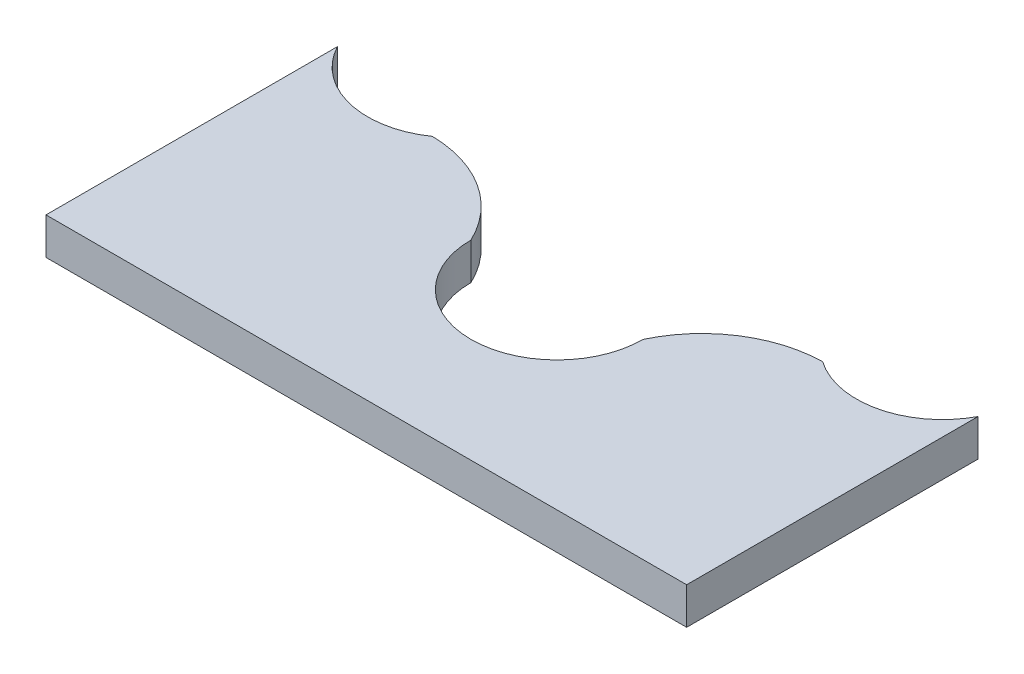
ISO-10303-21;
HEADER;
FILE_DESCRIPTION(('STEP AP214'),'2;1');
FILE_NAME('part.step','',(''),(''),'','','');
FILE_SCHEMA(('AUTOMOTIVE_DESIGN { 1 0 10303 214 1 1 1 1 }'));
ENDSEC;
DATA;
#1=APPLICATION_CONTEXT('core data for automotive mechanical design processes');
#2=APPLICATION_PROTOCOL_DEFINITION('international standard','automotive_design',2000,#1);
#3=PRODUCT_CONTEXT('',#1,'mechanical');
#4=PRODUCT('Part','Part','',(#3));
#5=PRODUCT_RELATED_PRODUCT_CATEGORY('part','',(#4));
#6=PRODUCT_DEFINITION_FORMATION('','',#4);
#7=PRODUCT_DEFINITION_CONTEXT('part definition',#1,'design');
#8=PRODUCT_DEFINITION('design','',#6,#7);
#9=PRODUCT_DEFINITION_SHAPE('','',#8);
#10=(LENGTH_UNIT() NAMED_UNIT(*) SI_UNIT(.MILLI.,.METRE.));
#11=(NAMED_UNIT(*) PLANE_ANGLE_UNIT() SI_UNIT($,.RADIAN.));
#12=(NAMED_UNIT(*) SI_UNIT($,.STERADIAN.) SOLID_ANGLE_UNIT());
#13=UNCERTAINTY_MEASURE_WITH_UNIT(LENGTH_MEASURE(1.E-05),#10,'distance_accuracy_value','');
#14=(GEOMETRIC_REPRESENTATION_CONTEXT(3) GLOBAL_UNCERTAINTY_ASSIGNED_CONTEXT((#13)) GLOBAL_UNIT_ASSIGNED_CONTEXT((#10,
#11,#12)) REPRESENTATION_CONTEXT('',''));
#15=CARTESIAN_POINT('',(0.,0.,0.));
#16=DIRECTION('',(0.,0.,1.));
#17=DIRECTION('',(1.,0.,0.));
#18=AXIS2_PLACEMENT_3D('',#15,#16,#17);
#19=CARTESIAN_POINT('',(16.0451571243017,3.,4.26440295899608));
#20=DIRECTION('',(0.,-1.,0.));
#21=DIRECTION('',(0.,0.,-1.));
#22=AXIS2_PLACEMENT_3D('',#19,#20,#21);
#23=CYLINDRICAL_SURFACE('',#22,10.);
#24=CARTESIAN_POINT('',(16.0451571243017,0.,4.26440295899608));
#25=DIRECTION('',(0.,1.,0.));
#26=DIRECTION('',(0.,0.,1.));
#27=AXIS2_PLACEMENT_3D('',#24,#25,#26);
#28=CIRCLE('',#27,10.);
#29=CARTESIAN_POINT('',(15.8700792263388,0.,-5.73406431002295));
#30=VERTEX_POINT('',#29);
#31=CARTESIAN_POINT('',(7.,0.,0.));
#32=VERTEX_POINT('',#31);
#33=EDGE_CURVE('E135',#30,#32,#28,.T.);
#34=ORIENTED_EDGE('',*,*,#33,.T.);
#35=DIRECTION('',(0.,-1.,0.));
#36=VECTOR('',#35,1.);
#37=CARTESIAN_POINT('',(7.,3.,0.));
#38=LINE('',#37,#36);
#39=CARTESIAN_POINT('',(7.,3.,0.));
#40=VERTEX_POINT('',#39);
#41=EDGE_CURVE('E11',#40,#32,#38,.T.);
#42=ORIENTED_EDGE('',*,*,#41,.F.);
#43=CARTESIAN_POINT('',(16.0451571243017,3.,4.26440295899608));
#44=DIRECTION('',(0.,1.,0.));
#45=DIRECTION('',(0.,0.,1.));
#46=AXIS2_PLACEMENT_3D('',#43,#44,#45);
#47=CIRCLE('',#46,10.);
#48=CARTESIAN_POINT('',(15.8700792263388,3.,-5.73406431002295));
#49=VERTEX_POINT('',#48);
#50=EDGE_CURVE('E149',#49,#40,#47,.T.);
#51=ORIENTED_EDGE('',*,*,#50,.F.);
#52=DIRECTION('',(0.,-1.,0.));
#53=VECTOR('',#52,1.);
#54=CARTESIAN_POINT('',(15.8700792263388,3.,-5.73406431002295));
#55=LINE('',#54,#53);
#56=EDGE_CURVE('E131',#49,#30,#55,.T.);
#57=ORIENTED_EDGE('',*,*,#56,.T.);
#58=EDGE_LOOP('',(#34,#42,#51,#57));
#59=FACE_BOUND('',#58,.T.);
#60=ADVANCED_FACE('F39',(#59),#23,.T.);
#61=CARTESIAN_POINT('',(0.,3.,0.));
#62=DIRECTION('',(0.,-1.,0.));
#63=DIRECTION('',(0.,0.,-1.));
#64=AXIS2_PLACEMENT_3D('',#61,#62,#63);
#65=CYLINDRICAL_SURFACE('',#64,7.);
#66=CARTESIAN_POINT('',(0.,0.,0.));
#67=DIRECTION('',(0.,-1.,0.));
#68=DIRECTION('',(0.,0.,-1.));
#69=AXIS2_PLACEMENT_3D('',#66,#67,#68);
#70=CIRCLE('',#69,7.);
#71=CARTESIAN_POINT('',(-7.,0.,0.));
#72=VERTEX_POINT('',#71);
#73=EDGE_CURVE('E138',#32,#72,#70,.T.);
#74=ORIENTED_EDGE('',*,*,#73,.T.);
#75=DIRECTION('',(0.,-1.,0.));
#76=VECTOR('',#75,1.);
#77=CARTESIAN_POINT('',(-7.,3.,0.));
#78=LINE('',#77,#76);
#79=CARTESIAN_POINT('',(-7.,3.,0.));
#80=VERTEX_POINT('',#79);
#81=EDGE_CURVE('E47',#80,#72,#78,.T.);
#82=ORIENTED_EDGE('',*,*,#81,.F.);
#83=CARTESIAN_POINT('',(0.,3.,0.));
#84=DIRECTION('',(0.,-1.,0.));
#85=DIRECTION('',(0.,0.,-1.));
#86=AXIS2_PLACEMENT_3D('',#83,#84,#85);
#87=CIRCLE('',#86,7.);
#88=EDGE_CURVE('E98',#40,#80,#87,.T.);
#89=ORIENTED_EDGE('',*,*,#88,.F.);
#90=ORIENTED_EDGE('',*,*,#41,.T.);
#91=EDGE_LOOP('',(#74,#82,#89,#90));
#92=FACE_BOUND('',#91,.T.);
#93=ADVANCED_FACE('F184',(#92),#65,.F.);
#94=CARTESIAN_POINT('',(-16.0451571243017,3.,4.26440295899608));
#95=DIRECTION('',(0.,-1.,0.));
#96=DIRECTION('',(0.,0.,-1.));
#97=AXIS2_PLACEMENT_3D('',#94,#95,#96);
#98=CYLINDRICAL_SURFACE('',#97,9.99999999999999);
#99=CARTESIAN_POINT('',(-16.0451571243017,0.,4.26440295899608));
#100=DIRECTION('',(0.,1.,0.));
#101=DIRECTION('',(0.,0.,1.));
#102=AXIS2_PLACEMENT_3D('',#99,#100,#101);
#103=CIRCLE('',#102,9.99999999999999);
#104=CARTESIAN_POINT('',(-15.8700792263388,0.,-5.73406431002294));
#105=VERTEX_POINT('',#104);
#106=EDGE_CURVE('E140',#72,#105,#103,.T.);
#107=ORIENTED_EDGE('',*,*,#106,.T.);
#108=DIRECTION('',(0.,-1.,0.));
#109=VECTOR('',#108,1.);
#110=CARTESIAN_POINT('',(-15.8700792263388,3.,-5.73406431002294));
#111=LINE('',#110,#109);
#112=CARTESIAN_POINT('',(-15.8700792263388,3.,-5.73406431002294));
#113=VERTEX_POINT('',#112);
#114=EDGE_CURVE('E156',#113,#105,#111,.T.);
#115=ORIENTED_EDGE('',*,*,#114,.F.);
#116=CARTESIAN_POINT('',(-16.0451571243017,3.,4.26440295899608));
#117=DIRECTION('',(0.,1.,0.));
#118=DIRECTION('',(0.,0.,1.));
#119=AXIS2_PLACEMENT_3D('',#116,#117,#118);
#120=CIRCLE('',#119,9.99999999999999);
#121=EDGE_CURVE('E164',#80,#113,#120,.T.);
#122=ORIENTED_EDGE('',*,*,#121,.F.);
#123=ORIENTED_EDGE('',*,*,#81,.T.);
#124=EDGE_LOOP('',(#107,#115,#122,#123));
#125=FACE_BOUND('',#124,.T.);
#126=ADVANCED_FACE('F162',(#125),#98,.T.);
#127=CARTESIAN_POINT('',(-19.8752830168529,3.,-11.4749999999999));
#128=DIRECTION('',(0.,-1.,0.));
#129=DIRECTION('',(0.,0.,-1.));
#130=AXIS2_PLACEMENT_3D('',#127,#128,#129);
#131=CYLINDRICAL_SURFACE('',#130,7.);
#132=CARTESIAN_POINT('',(-19.8752830168529,0.,-11.4749999999999));
#133=DIRECTION('',(0.,-1.,0.));
#134=DIRECTION('',(0.,0.,-1.));
#135=AXIS2_PLACEMENT_3D('',#132,#133,#134);
#136=CIRCLE('',#135,7.);
#137=CARTESIAN_POINT('',(-26.0555691185354,0.,-8.18804644064587));
#138=VERTEX_POINT('',#137);
#139=EDGE_CURVE('E142',#105,#138,#136,.T.);
#140=ORIENTED_EDGE('',*,*,#139,.T.);
#141=DIRECTION('',(0.,-1.,0.));
#142=VECTOR('',#141,1.);
#143=CARTESIAN_POINT('',(-26.0555691185354,3.,-8.18804644064587));
#144=LINE('',#143,#142);
#145=CARTESIAN_POINT('',(-26.0555691185354,3.,-8.18804644064587));
#146=VERTEX_POINT('',#145);
#147=EDGE_CURVE('E153',#146,#138,#144,.T.);
#148=ORIENTED_EDGE('',*,*,#147,.F.);
#149=CARTESIAN_POINT('',(-19.8752830168529,3.,-11.4749999999999));
#150=DIRECTION('',(0.,-1.,0.));
#151=DIRECTION('',(0.,0.,-1.));
#152=AXIS2_PLACEMENT_3D('',#149,#150,#151);
#153=CIRCLE('',#152,7.);
#154=EDGE_CURVE('E176',#113,#146,#153,.T.);
#155=ORIENTED_EDGE('',*,*,#154,.F.);
#156=ORIENTED_EDGE('',*,*,#114,.T.);
#157=EDGE_LOOP('',(#140,#148,#155,#156));
#158=FACE_BOUND('',#157,.T.);
#159=ADVANCED_FACE('F172',(#158),#131,.F.);
#160=CARTESIAN_POINT('',(-26.0555691185354,3.,15.5111622184162));
#161=DIRECTION('',(1.,0.,0.));
#162=DIRECTION('',(0.,0.,-1.));
#163=AXIS2_PLACEMENT_3D('',#160,#161,#162);
#164=PLANE('',#163);
#165=DIRECTION('',(0.,0.,1.));
#166=VECTOR('',#165,1.);
#167=CARTESIAN_POINT('',(-26.0555691185354,0.,15.5111622184162));
#168=LINE('',#167,#166);
#169=CARTESIAN_POINT('',(-26.0555691185354,0.,15.5111622184162));
#170=VERTEX_POINT('',#169);
#171=EDGE_CURVE('E144',#138,#170,#168,.T.);
#172=ORIENTED_EDGE('',*,*,#171,.T.);
#173=DIRECTION('',(0.,-1.,0.));
#174=VECTOR('',#173,1.);
#175=CARTESIAN_POINT('',(-26.0555691185354,3.,15.5111622184162));
#176=LINE('',#175,#174);
#177=CARTESIAN_POINT('',(-26.0555691185354,3.,15.5111622184162));
#178=VERTEX_POINT('',#177);
#179=EDGE_CURVE('E126',#178,#170,#176,.T.);
#180=ORIENTED_EDGE('',*,*,#179,.F.);
#181=DIRECTION('',(0.,0.,1.));
#182=VECTOR('',#181,1.);
#183=CARTESIAN_POINT('',(-26.0555691185354,3.,15.5111622184162));
#184=LINE('',#183,#182);
#185=EDGE_CURVE('E117',#146,#178,#184,.T.);
#186=ORIENTED_EDGE('',*,*,#185,.F.);
#187=ORIENTED_EDGE('',*,*,#147,.T.);
#188=EDGE_LOOP('',(#172,#180,#186,#187));
#189=FACE_BOUND('',#188,.T.);
#190=ADVANCED_FACE('F175',(#189),#164,.F.);
#191=CARTESIAN_POINT('',(26.0555691185354,3.,15.5111622184162));
#192=DIRECTION('',(0.,0.,-1.));
#193=DIRECTION('',(-1.,0.,0.));
#194=AXIS2_PLACEMENT_3D('',#191,#192,#193);
#195=PLANE('',#194);
#196=DIRECTION('',(1.,0.,0.));
#197=VECTOR('',#196,1.);
#198=CARTESIAN_POINT('',(26.0555691185354,0.,15.5111622184162));
#199=LINE('',#198,#197);
#200=CARTESIAN_POINT('',(26.0555691185354,0.,15.5111622184162));
#201=VERTEX_POINT('',#200);
#202=EDGE_CURVE('E125',#170,#201,#199,.T.);
#203=ORIENTED_EDGE('',*,*,#202,.T.);
#204=DIRECTION('',(0.,-1.,0.));
#205=VECTOR('',#204,1.);
#206=CARTESIAN_POINT('',(26.0555691185354,3.,15.5111622184162));
#207=LINE('',#206,#205);
#208=CARTESIAN_POINT('',(26.0555691185354,3.,15.5111622184162));
#209=VERTEX_POINT('',#208);
#210=EDGE_CURVE('E122',#209,#201,#207,.T.);
#211=ORIENTED_EDGE('',*,*,#210,.F.);
#212=DIRECTION('',(1.,0.,0.));
#213=VECTOR('',#212,1.);
#214=CARTESIAN_POINT('',(26.0555691185354,3.,15.5111622184162));
#215=LINE('',#214,#213);
#216=EDGE_CURVE('E111',#178,#209,#215,.T.);
#217=ORIENTED_EDGE('',*,*,#216,.F.);
#218=ORIENTED_EDGE('',*,*,#179,.T.);
#219=EDGE_LOOP('',(#203,#211,#217,#218));
#220=FACE_BOUND('',#219,.T.);
#221=ADVANCED_FACE('F123',(#220),#195,.F.);
#222=CARTESIAN_POINT('',(26.0555691185354,3.,-8.18804644064582));
#223=DIRECTION('',(-1.,0.,0.));
#224=DIRECTION('',(0.,0.,1.));
#225=AXIS2_PLACEMENT_3D('',#222,#223,#224);
#226=PLANE('',#225);
#227=DIRECTION('',(0.,0.,-1.));
#228=VECTOR('',#227,1.);
#229=CARTESIAN_POINT('',(26.0555691185354,0.,-8.18804644064582));
#230=LINE('',#229,#228);
#231=CARTESIAN_POINT('',(26.0555691185354,0.,-8.18804644064582));
#232=VERTEX_POINT('',#231);
#233=EDGE_CURVE('E84',#201,#232,#230,.T.);
#234=ORIENTED_EDGE('',*,*,#233,.T.);
#235=DIRECTION('',(0.,-1.,0.));
#236=VECTOR('',#235,1.);
#237=CARTESIAN_POINT('',(26.0555691185354,3.,-8.18804644064582));
#238=LINE('',#237,#236);
#239=CARTESIAN_POINT('',(26.0555691185354,3.,-8.18804644064582));
#240=VERTEX_POINT('',#239);
#241=EDGE_CURVE('E127',#240,#232,#238,.T.);
#242=ORIENTED_EDGE('',*,*,#241,.F.);
#243=DIRECTION('',(0.,0.,-1.));
#244=VECTOR('',#243,1.);
#245=CARTESIAN_POINT('',(26.0555691185354,3.,-8.18804644064582));
#246=LINE('',#245,#244);
#247=EDGE_CURVE('E115',#209,#240,#246,.T.);
#248=ORIENTED_EDGE('',*,*,#247,.F.);
#249=ORIENTED_EDGE('',*,*,#210,.T.);
#250=EDGE_LOOP('',(#234,#242,#248,#249));
#251=FACE_BOUND('',#250,.T.);
#252=ADVANCED_FACE('F129',(#251),#226,.F.);
#253=CARTESIAN_POINT('',(19.8752830168529,3.,-11.4749999999999));
#254=DIRECTION('',(0.,-1.,0.));
#255=DIRECTION('',(0.,0.,-1.));
#256=AXIS2_PLACEMENT_3D('',#253,#254,#255);
#257=CYLINDRICAL_SURFACE('',#256,7.);
#258=CARTESIAN_POINT('',(19.8752830168529,0.,-11.4749999999999));
#259=DIRECTION('',(0.,-1.,0.));
#260=DIRECTION('',(0.,0.,1.));
#261=AXIS2_PLACEMENT_3D('',#258,#259,#260);
#262=CIRCLE('',#261,7.);
#263=EDGE_CURVE('E90',#232,#30,#262,.T.);
#264=ORIENTED_EDGE('',*,*,#263,.T.);
#265=ORIENTED_EDGE('',*,*,#56,.F.);
#266=CARTESIAN_POINT('',(19.8752830168529,3.,-11.4749999999999));
#267=DIRECTION('',(0.,-1.,0.));
#268=DIRECTION('',(0.,0.,1.));
#269=AXIS2_PLACEMENT_3D('',#266,#267,#268);
#270=CIRCLE('',#269,7.);
#271=EDGE_CURVE('E55',#240,#49,#270,.T.);
#272=ORIENTED_EDGE('',*,*,#271,.F.);
#273=ORIENTED_EDGE('',*,*,#241,.T.);
#274=EDGE_LOOP('',(#264,#265,#272,#273));
#275=FACE_BOUND('',#274,.T.);
#276=ADVANCED_FACE('F200',(#275),#257,.F.);
#277=CARTESIAN_POINT('',(16.0451571243017,3.,4.26440295899608));
#278=DIRECTION('',(0.,1.,0.));
#279=DIRECTION('',(0.,0.,1.));
#280=AXIS2_PLACEMENT_3D('',#277,#278,#279);
#281=PLANE('',#280);
#282=ORIENTED_EDGE('',*,*,#50,.T.);
#283=ORIENTED_EDGE('',*,*,#88,.T.);
#284=ORIENTED_EDGE('',*,*,#121,.T.);
#285=ORIENTED_EDGE('',*,*,#154,.T.);
#286=ORIENTED_EDGE('',*,*,#185,.T.);
#287=ORIENTED_EDGE('',*,*,#216,.T.);
#288=ORIENTED_EDGE('',*,*,#247,.T.);
#289=ORIENTED_EDGE('',*,*,#271,.T.);
#290=EDGE_LOOP('',(#282,#283,#284,#285,#286,#287,#288,#289));
#291=FACE_BOUND('',#290,.T.);
#292=ADVANCED_FACE('F113',(#291),#281,.T.);
#293=CARTESIAN_POINT('',(16.0451571243017,0.,4.26440295899608));
#294=DIRECTION('',(0.,1.,0.));
#295=DIRECTION('',(0.,0.,1.));
#296=AXIS2_PLACEMENT_3D('',#293,#294,#295);
#297=PLANE('',#296);
#298=ORIENTED_EDGE('',*,*,#33,.F.);
#299=ORIENTED_EDGE('',*,*,#263,.F.);
#300=ORIENTED_EDGE('',*,*,#233,.F.);
#301=ORIENTED_EDGE('',*,*,#202,.F.);
#302=ORIENTED_EDGE('',*,*,#171,.F.);
#303=ORIENTED_EDGE('',*,*,#139,.F.);
#304=ORIENTED_EDGE('',*,*,#106,.F.);
#305=ORIENTED_EDGE('',*,*,#73,.F.);
#306=EDGE_LOOP('',(#298,#299,#300,#301,#302,#303,#304,#305));
#307=FACE_BOUND('',#306,.T.);
#308=ADVANCED_FACE('F168',(#307),#297,.F.);
#309=CLOSED_SHELL('',(#60,#93,#126,#159,#190,#221,#252,#276,#292,#308));
#310=MANIFOLD_SOLID_BREP('B2',#309);
#311=ADVANCED_BREP_SHAPE_REPRESENTATION('',(#18,#310),#14);
#312=SHAPE_DEFINITION_REPRESENTATION(#9,#311);
ENDSEC;
END-ISO-10303-21;
